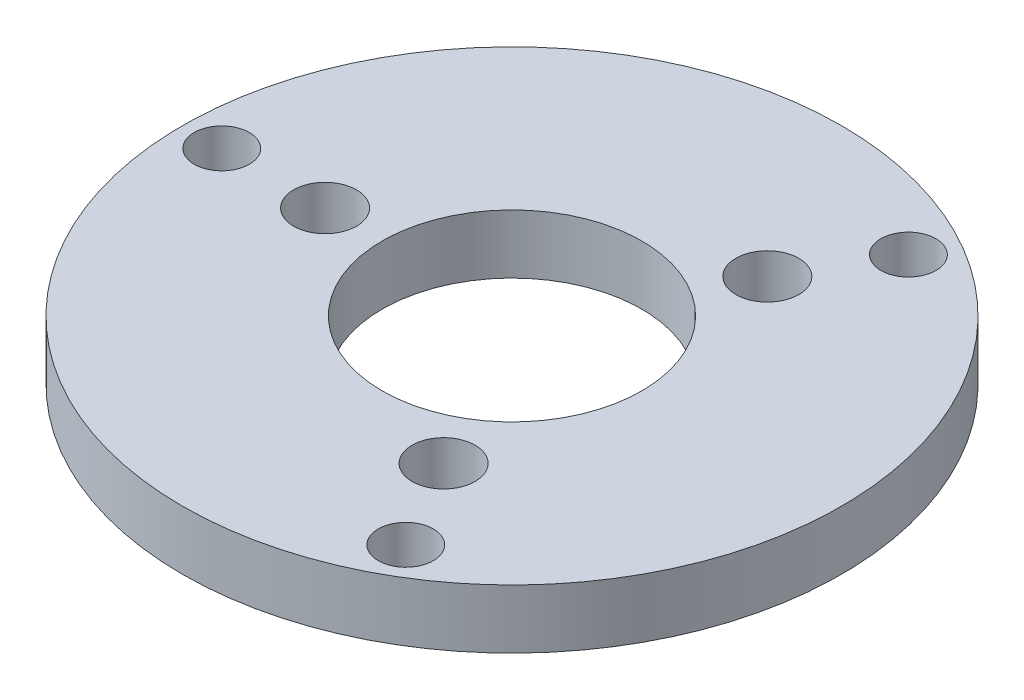
ISO-10303-21;
HEADER;
FILE_DESCRIPTION(('STEP AP214'),'2;1');
FILE_NAME('part.step','',(''),(''),'','','');
FILE_SCHEMA(('AUTOMOTIVE_DESIGN { 1 0 10303 214 1 1 1 1 }'));
ENDSEC;
DATA;
#1=APPLICATION_CONTEXT('core data for automotive mechanical design processes');
#2=APPLICATION_PROTOCOL_DEFINITION('international standard','automotive_design',2000,#1);
#3=PRODUCT_CONTEXT('',#1,'mechanical');
#4=PRODUCT('Part','Part','',(#3));
#5=PRODUCT_RELATED_PRODUCT_CATEGORY('part','',(#4));
#6=PRODUCT_DEFINITION_FORMATION('','',#4);
#7=PRODUCT_DEFINITION_CONTEXT('part definition',#1,'design');
#8=PRODUCT_DEFINITION('design','',#6,#7);
#9=PRODUCT_DEFINITION_SHAPE('','',#8);
#10=(LENGTH_UNIT() NAMED_UNIT(*) SI_UNIT(.MILLI.,.METRE.));
#11=(NAMED_UNIT(*) PLANE_ANGLE_UNIT() SI_UNIT($,.RADIAN.));
#12=(NAMED_UNIT(*) SI_UNIT($,.STERADIAN.) SOLID_ANGLE_UNIT());
#13=UNCERTAINTY_MEASURE_WITH_UNIT(LENGTH_MEASURE(1.E-05),#10,'distance_accuracy_value','');
#14=(GEOMETRIC_REPRESENTATION_CONTEXT(3) GLOBAL_UNCERTAINTY_ASSIGNED_CONTEXT((#13)) GLOBAL_UNIT_ASSIGNED_CONTEXT((#10,
#11,#12)) REPRESENTATION_CONTEXT('',''));
#15=CARTESIAN_POINT('',(0.,0.,0.));
#16=DIRECTION('',(0.,0.,1.));
#17=DIRECTION('',(1.,0.,0.));
#18=AXIS2_PLACEMENT_3D('',#15,#16,#17);
#19=CARTESIAN_POINT('',(0.,3.,0.));
#20=DIRECTION('',(0.,-1.,0.));
#21=DIRECTION('',(0.,0.,-1.));
#22=AXIS2_PLACEMENT_3D('',#19,#20,#21);
#23=CYLINDRICAL_SURFACE('',#22,16.75);
#24=CARTESIAN_POINT('',(0.,3.,0.));
#25=DIRECTION('',(0.,1.,0.));
#26=DIRECTION('',(0.,0.,1.));
#27=AXIS2_PLACEMENT_3D('',#24,#25,#26);
#28=CIRCLE('',#27,16.75);
#29=CARTESIAN_POINT('',(0.,3.,16.75));
#30=VERTEX_POINT('',#29);
#31=EDGE_CURVE('E10',#30,#30,#28,.T.);
#32=ORIENTED_EDGE('',*,*,#31,.F.);
#33=EDGE_LOOP('',(#32));
#34=FACE_BOUND('',#33,.T.);
#35=CARTESIAN_POINT('',(0.,0.,0.));
#36=DIRECTION('',(0.,1.,0.));
#37=DIRECTION('',(0.,0.,1.));
#38=AXIS2_PLACEMENT_3D('',#35,#36,#37);
#39=CIRCLE('',#38,16.75);
#40=CARTESIAN_POINT('',(0.,0.,16.75));
#41=VERTEX_POINT('',#40);
#42=EDGE_CURVE('E39',#41,#41,#39,.T.);
#43=ORIENTED_EDGE('',*,*,#42,.T.);
#44=EDGE_LOOP('',(#43));
#45=FACE_BOUND('',#44,.T.);
#46=ADVANCED_FACE('F32',(#34,#45),#23,.T.);
#47=CARTESIAN_POINT('',(0.,3.,0.));
#48=DIRECTION('',(0.,1.,0.));
#49=DIRECTION('',(0.,0.,1.));
#50=AXIS2_PLACEMENT_3D('',#47,#48,#49);
#51=PLANE('',#50);
#52=CARTESIAN_POINT('',(7.37500000000001,3.,12.7738747058205));
#53=DIRECTION('',(0.,1.,0.));
#54=DIRECTION('',(0.,0.,1.));
#55=AXIS2_PLACEMENT_3D('',#52,#53,#54);
#56=CIRCLE('',#55,1.4);
#57=CARTESIAN_POINT('',(7.37500000000001,3.,14.1738747058205));
#58=VERTEX_POINT('',#57);
#59=EDGE_CURVE('E53',#58,#58,#56,.T.);
#60=ORIENTED_EDGE('',*,*,#59,.F.);
#61=EDGE_LOOP('',(#60));
#62=FACE_BOUND('',#61,.T.);
#63=CARTESIAN_POINT('',(7.375,3.,-12.7738747058205));
#64=DIRECTION('',(0.,1.,0.));
#65=DIRECTION('',(0.,0.,1.));
#66=AXIS2_PLACEMENT_3D('',#63,#64,#65);
#67=CIRCLE('',#66,1.4);
#68=CARTESIAN_POINT('',(7.375,3.,-11.3738747058205));
#69=VERTEX_POINT('',#68);
#70=EDGE_CURVE('E119',#69,#69,#67,.T.);
#71=ORIENTED_EDGE('',*,*,#70,.F.);
#72=EDGE_LOOP('',(#71));
#73=FACE_BOUND('',#72,.T.);
#74=CARTESIAN_POINT('',(-14.75,3.,0.));
#75=DIRECTION('',(0.,1.,0.));
#76=DIRECTION('',(0.,0.,1.));
#77=AXIS2_PLACEMENT_3D('',#74,#75,#76);
#78=CIRCLE('',#77,1.4);
#79=CARTESIAN_POINT('',(-14.75,3.,1.4));
#80=VERTEX_POINT('',#79);
#81=EDGE_CURVE('E123',#80,#80,#78,.T.);
#82=ORIENTED_EDGE('',*,*,#81,.F.);
#83=EDGE_LOOP('',(#82));
#84=FACE_BOUND('',#83,.T.);
#85=CARTESIAN_POINT('',(0.,3.,0.));
#86=DIRECTION('',(0.,1.,0.));
#87=DIRECTION('',(0.,0.,1.));
#88=AXIS2_PLACEMENT_3D('',#85,#86,#87);
#89=CIRCLE('',#88,6.6);
#90=CARTESIAN_POINT('',(0.,3.,6.6));
#91=VERTEX_POINT('',#90);
#92=EDGE_CURVE('E58',#91,#91,#89,.T.);
#93=ORIENTED_EDGE('',*,*,#92,.F.);
#94=EDGE_LOOP('',(#93));
#95=FACE_BOUND('',#94,.T.);
#96=CARTESIAN_POINT('',(4.75000000000002,3.,8.22724133595216));
#97=DIRECTION('',(0.,1.,0.));
#98=DIRECTION('',(0.,0.,1.));
#99=AXIS2_PLACEMENT_3D('',#96,#97,#98);
#100=CIRCLE('',#99,1.6);
#101=CARTESIAN_POINT('',(4.75000000000002,3.,9.82724133595216));
#102=VERTEX_POINT('',#101);
#103=EDGE_CURVE('E72',#102,#102,#100,.T.);
#104=ORIENTED_EDGE('',*,*,#103,.F.);
#105=EDGE_LOOP('',(#104));
#106=FACE_BOUND('',#105,.T.);
#107=CARTESIAN_POINT('',(4.74999999999998,3.,-8.22724133595218));
#108=DIRECTION('',(0.,1.,0.));
#109=DIRECTION('',(0.,0.,1.));
#110=AXIS2_PLACEMENT_3D('',#107,#108,#109);
#111=CIRCLE('',#110,1.6);
#112=CARTESIAN_POINT('',(4.74999999999998,3.,-6.62724133595218));
#113=VERTEX_POINT('',#112);
#114=EDGE_CURVE('E75',#113,#113,#111,.T.);
#115=ORIENTED_EDGE('',*,*,#114,.F.);
#116=EDGE_LOOP('',(#115));
#117=FACE_BOUND('',#116,.T.);
#118=CARTESIAN_POINT('',(-9.5,3.,0.));
#119=DIRECTION('',(0.,1.,0.));
#120=DIRECTION('',(0.,0.,1.));
#121=AXIS2_PLACEMENT_3D('',#118,#119,#120);
#122=CIRCLE('',#121,1.6);
#123=CARTESIAN_POINT('',(-9.5,3.,1.60000000000003));
#124=VERTEX_POINT('',#123);
#125=EDGE_CURVE('E80',#124,#124,#122,.T.);
#126=ORIENTED_EDGE('',*,*,#125,.F.);
#127=EDGE_LOOP('',(#126));
#128=FACE_BOUND('',#127,.T.);
#129=ORIENTED_EDGE('',*,*,#31,.T.);
#130=EDGE_LOOP('',(#129));
#131=FACE_BOUND('',#130,.T.);
#132=ADVANCED_FACE('F101',(#62,#73,#84,#95,#106,#117,#128,#131),#51,.T.);
#133=CARTESIAN_POINT('',(0.,0.,0.));
#134=DIRECTION('',(0.,1.,0.));
#135=DIRECTION('',(0.,0.,1.));
#136=AXIS2_PLACEMENT_3D('',#133,#134,#135);
#137=PLANE('',#136);
#138=CARTESIAN_POINT('',(7.37500000000001,0.,12.7738747058205));
#139=DIRECTION('',(0.,1.,0.));
#140=DIRECTION('',(0.,0.,1.));
#141=AXIS2_PLACEMENT_3D('',#138,#139,#140);
#142=CIRCLE('',#141,1.4);
#143=CARTESIAN_POINT('',(7.37500000000001,0.,14.1738747058205));
#144=VERTEX_POINT('',#143);
#145=EDGE_CURVE('E35',#144,#144,#142,.T.);
#146=ORIENTED_EDGE('',*,*,#145,.T.);
#147=EDGE_LOOP('',(#146));
#148=FACE_BOUND('',#147,.T.);
#149=CARTESIAN_POINT('',(7.375,0.,-12.7738747058205));
#150=DIRECTION('',(0.,1.,0.));
#151=DIRECTION('',(0.,0.,1.));
#152=AXIS2_PLACEMENT_3D('',#149,#150,#151);
#153=CIRCLE('',#152,1.4);
#154=CARTESIAN_POINT('',(7.375,0.,-11.3738747058205));
#155=VERTEX_POINT('',#154);
#156=EDGE_CURVE('E52',#155,#155,#153,.T.);
#157=ORIENTED_EDGE('',*,*,#156,.T.);
#158=EDGE_LOOP('',(#157));
#159=FACE_BOUND('',#158,.T.);
#160=CARTESIAN_POINT('',(-14.75,0.,0.));
#161=DIRECTION('',(0.,1.,0.));
#162=DIRECTION('',(0.,0.,1.));
#163=AXIS2_PLACEMENT_3D('',#160,#161,#162);
#164=CIRCLE('',#163,1.4);
#165=CARTESIAN_POINT('',(-14.75,0.,1.4));
#166=VERTEX_POINT('',#165);
#167=EDGE_CURVE('E50',#166,#166,#164,.T.);
#168=ORIENTED_EDGE('',*,*,#167,.T.);
#169=EDGE_LOOP('',(#168));
#170=FACE_BOUND('',#169,.T.);
#171=CARTESIAN_POINT('',(0.,0.,0.));
#172=DIRECTION('',(0.,1.,0.));
#173=DIRECTION('',(0.,0.,1.));
#174=AXIS2_PLACEMENT_3D('',#171,#172,#173);
#175=CIRCLE('',#174,6.6);
#176=CARTESIAN_POINT('',(0.,0.,6.6));
#177=VERTEX_POINT('',#176);
#178=EDGE_CURVE('E62',#177,#177,#175,.T.);
#179=ORIENTED_EDGE('',*,*,#178,.T.);
#180=EDGE_LOOP('',(#179));
#181=FACE_BOUND('',#180,.T.);
#182=CARTESIAN_POINT('',(4.75000000000002,0.,8.22724133595216));
#183=DIRECTION('',(0.,1.,0.));
#184=DIRECTION('',(0.,0.,1.));
#185=AXIS2_PLACEMENT_3D('',#182,#183,#184);
#186=CIRCLE('',#185,1.6);
#187=CARTESIAN_POINT('',(4.75000000000002,0.,9.82724133595216));
#188=VERTEX_POINT('',#187);
#189=EDGE_CURVE('E44',#188,#188,#186,.T.);
#190=ORIENTED_EDGE('',*,*,#189,.T.);
#191=EDGE_LOOP('',(#190));
#192=FACE_BOUND('',#191,.T.);
#193=CARTESIAN_POINT('',(4.74999999999998,0.,-8.22724133595218));
#194=DIRECTION('',(0.,1.,0.));
#195=DIRECTION('',(0.,0.,1.));
#196=AXIS2_PLACEMENT_3D('',#193,#194,#195);
#197=CIRCLE('',#196,1.6);
#198=CARTESIAN_POINT('',(4.74999999999998,0.,-6.62724133595218));
#199=VERTEX_POINT('',#198);
#200=EDGE_CURVE('E78',#199,#199,#197,.T.);
#201=ORIENTED_EDGE('',*,*,#200,.T.);
#202=EDGE_LOOP('',(#201));
#203=FACE_BOUND('',#202,.T.);
#204=CARTESIAN_POINT('',(-9.5,0.,0.));
#205=DIRECTION('',(0.,1.,0.));
#206=DIRECTION('',(0.,0.,1.));
#207=AXIS2_PLACEMENT_3D('',#204,#205,#206);
#208=CIRCLE('',#207,1.6);
#209=CARTESIAN_POINT('',(-9.5,0.,1.60000000000003));
#210=VERTEX_POINT('',#209);
#211=EDGE_CURVE('E47',#210,#210,#208,.T.);
#212=ORIENTED_EDGE('',*,*,#211,.T.);
#213=EDGE_LOOP('',(#212));
#214=FACE_BOUND('',#213,.T.);
#215=ORIENTED_EDGE('',*,*,#42,.F.);
#216=EDGE_LOOP('',(#215));
#217=FACE_BOUND('',#216,.T.);
#218=ADVANCED_FACE('F87',(#148,#159,#170,#181,#192,#203,#214,#217),#137,.F.);
#219=CARTESIAN_POINT('',(-9.5,0.,0.));
#220=DIRECTION('',(0.,1.,0.));
#221=DIRECTION('',(0.,0.,1.));
#222=AXIS2_PLACEMENT_3D('',#219,#220,#221);
#223=CYLINDRICAL_SURFACE('',#222,1.6);
#224=ORIENTED_EDGE('',*,*,#211,.F.);
#225=EDGE_LOOP('',(#224));
#226=FACE_BOUND('',#225,.T.);
#227=ORIENTED_EDGE('',*,*,#125,.T.);
#228=EDGE_LOOP('',(#227));
#229=FACE_BOUND('',#228,.T.);
#230=ADVANCED_FACE('F90',(#226,#229),#223,.F.);
#231=CARTESIAN_POINT('',(4.74999999999998,0.,-8.22724133595218));
#232=DIRECTION('',(0.,1.,0.));
#233=DIRECTION('',(0.,0.,1.));
#234=AXIS2_PLACEMENT_3D('',#231,#232,#233);
#235=CYLINDRICAL_SURFACE('',#234,1.6);
#236=ORIENTED_EDGE('',*,*,#200,.F.);
#237=EDGE_LOOP('',(#236));
#238=FACE_BOUND('',#237,.T.);
#239=ORIENTED_EDGE('',*,*,#114,.T.);
#240=EDGE_LOOP('',(#239));
#241=FACE_BOUND('',#240,.T.);
#242=ADVANCED_FACE('F92',(#238,#241),#235,.F.);
#243=CARTESIAN_POINT('',(4.75000000000002,0.,8.22724133595216));
#244=DIRECTION('',(0.,1.,0.));
#245=DIRECTION('',(0.,0.,1.));
#246=AXIS2_PLACEMENT_3D('',#243,#244,#245);
#247=CYLINDRICAL_SURFACE('',#246,1.6);
#248=ORIENTED_EDGE('',*,*,#189,.F.);
#249=EDGE_LOOP('',(#248));
#250=FACE_BOUND('',#249,.T.);
#251=ORIENTED_EDGE('',*,*,#103,.T.);
#252=EDGE_LOOP('',(#251));
#253=FACE_BOUND('',#252,.T.);
#254=ADVANCED_FACE('F98',(#250,#253),#247,.F.);
#255=CARTESIAN_POINT('',(0.,0.,0.));
#256=DIRECTION('',(0.,1.,0.));
#257=DIRECTION('',(0.,0.,1.));
#258=AXIS2_PLACEMENT_3D('',#255,#256,#257);
#259=CYLINDRICAL_SURFACE('',#258,6.6);
#260=ORIENTED_EDGE('',*,*,#178,.F.);
#261=EDGE_LOOP('',(#260));
#262=FACE_BOUND('',#261,.T.);
#263=ORIENTED_EDGE('',*,*,#92,.T.);
#264=EDGE_LOOP('',(#263));
#265=FACE_BOUND('',#264,.T.);
#266=ADVANCED_FACE('F132',(#262,#265),#259,.F.);
#267=CARTESIAN_POINT('',(-14.75,-7.,0.));
#268=DIRECTION('',(0.,1.,0.));
#269=DIRECTION('',(0.,0.,1.));
#270=AXIS2_PLACEMENT_3D('',#267,#268,#269);
#271=CYLINDRICAL_SURFACE('',#270,1.4);
#272=ORIENTED_EDGE('',*,*,#81,.T.);
#273=EDGE_LOOP('',(#272));
#274=FACE_BOUND('',#273,.T.);
#275=ORIENTED_EDGE('',*,*,#167,.F.);
#276=EDGE_LOOP('',(#275));
#277=FACE_BOUND('',#276,.T.);
#278=ADVANCED_FACE('F138',(#274,#277),#271,.F.);
#279=CARTESIAN_POINT('',(7.375,-7.,-12.7738747058205));
#280=DIRECTION('',(0.,1.,0.));
#281=DIRECTION('',(0.,0.,1.));
#282=AXIS2_PLACEMENT_3D('',#279,#280,#281);
#283=CYLINDRICAL_SURFACE('',#282,1.4);
#284=ORIENTED_EDGE('',*,*,#70,.T.);
#285=EDGE_LOOP('',(#284));
#286=FACE_BOUND('',#285,.T.);
#287=ORIENTED_EDGE('',*,*,#156,.F.);
#288=EDGE_LOOP('',(#287));
#289=FACE_BOUND('',#288,.T.);
#290=ADVANCED_FACE('F145',(#286,#289),#283,.F.);
#291=CARTESIAN_POINT('',(7.37500000000001,-7.,12.7738747058205));
#292=DIRECTION('',(0.,1.,0.));
#293=DIRECTION('',(0.,0.,1.));
#294=AXIS2_PLACEMENT_3D('',#291,#292,#293);
#295=CYLINDRICAL_SURFACE('',#294,1.4);
#296=ORIENTED_EDGE('',*,*,#59,.T.);
#297=EDGE_LOOP('',(#296));
#298=FACE_BOUND('',#297,.T.);
#299=ORIENTED_EDGE('',*,*,#145,.F.);
#300=EDGE_LOOP('',(#299));
#301=FACE_BOUND('',#300,.T.);
#302=ADVANCED_FACE('F149',(#298,#301),#295,.F.);
#303=CLOSED_SHELL('',(#46,#132,#218,#230,#242,#254,#266,#278,#290,#302));
#304=MANIFOLD_SOLID_BREP('B2',#303);
#305=ADVANCED_BREP_SHAPE_REPRESENTATION('',(#18,#304),#14);
#306=SHAPE_DEFINITION_REPRESENTATION(#9,#305);
ENDSEC;
END-ISO-10303-21;
